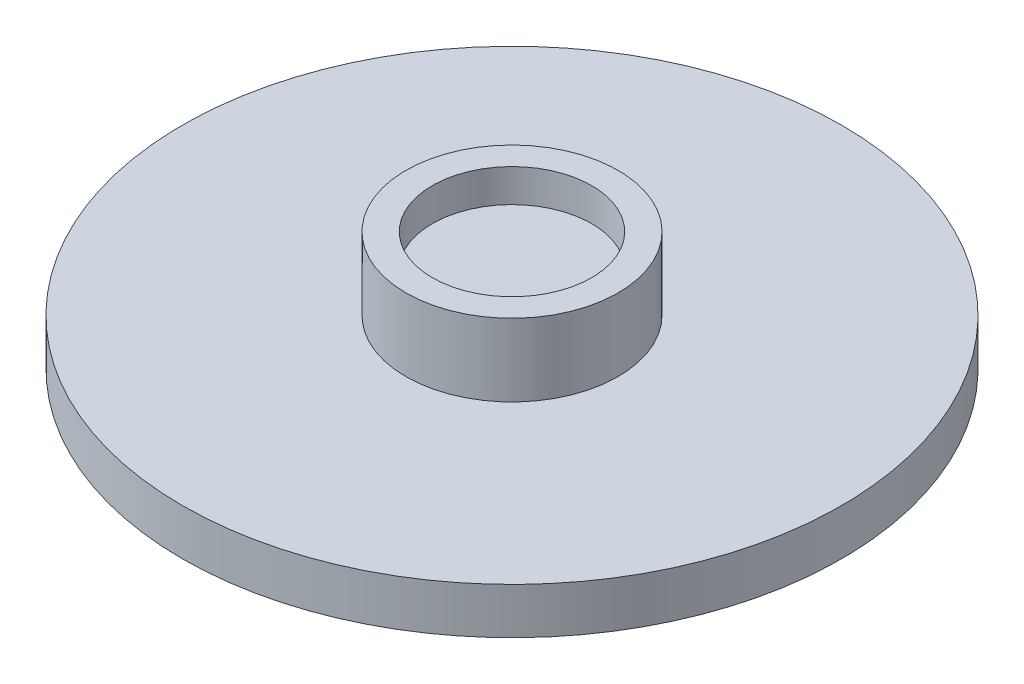
ISO-10303-21;
HEADER;
FILE_DESCRIPTION(('STEP AP214'),'2;1');
FILE_NAME('part.step','',(''),(''),'','','');
FILE_SCHEMA(('AUTOMOTIVE_DESIGN { 1 0 10303 214 1 1 1 1 }'));
ENDSEC;
DATA;
#1=APPLICATION_CONTEXT('core data for automotive mechanical design processes');
#2=APPLICATION_PROTOCOL_DEFINITION('international standard','automotive_design',2000,#1);
#3=PRODUCT_CONTEXT('',#1,'mechanical');
#4=PRODUCT('Part','Part','',(#3));
#5=PRODUCT_RELATED_PRODUCT_CATEGORY('part','',(#4));
#6=PRODUCT_DEFINITION_FORMATION('','',#4);
#7=PRODUCT_DEFINITION_CONTEXT('part definition',#1,'design');
#8=PRODUCT_DEFINITION('design','',#6,#7);
#9=PRODUCT_DEFINITION_SHAPE('','',#8);
#10=(LENGTH_UNIT() NAMED_UNIT(*) SI_UNIT(.MILLI.,.METRE.));
#11=(NAMED_UNIT(*) PLANE_ANGLE_UNIT() SI_UNIT($,.RADIAN.));
#12=(NAMED_UNIT(*) SI_UNIT($,.STERADIAN.) SOLID_ANGLE_UNIT());
#13=UNCERTAINTY_MEASURE_WITH_UNIT(LENGTH_MEASURE(1.E-05),#10,'distance_accuracy_value','');
#14=(GEOMETRIC_REPRESENTATION_CONTEXT(3) GLOBAL_UNCERTAINTY_ASSIGNED_CONTEXT((#13)) GLOBAL_UNIT_ASSIGNED_CONTEXT((#10,
#11,#12)) REPRESENTATION_CONTEXT('',''));
#15=CARTESIAN_POINT('',(0.,0.,0.));
#16=DIRECTION('',(0.,0.,1.));
#17=DIRECTION('',(1.,0.,0.));
#18=AXIS2_PLACEMENT_3D('',#15,#16,#17);
#19=CARTESIAN_POINT('',(0.,3.5,0.));
#20=DIRECTION('',(0.,-1.,0.));
#21=DIRECTION('',(0.,0.,-1.));
#22=AXIS2_PLACEMENT_3D('',#19,#20,#21);
#23=CYLINDRICAL_SURFACE('',#22,25.);
#24=CARTESIAN_POINT('',(0.,3.5,0.));
#25=DIRECTION('',(0.,1.,0.));
#26=DIRECTION('',(0.,0.,1.));
#27=AXIS2_PLACEMENT_3D('',#24,#25,#26);
#28=CIRCLE('',#27,25.);
#29=CARTESIAN_POINT('',(0.,3.5,25.));
#30=VERTEX_POINT('',#29);
#31=EDGE_CURVE('E44',#30,#30,#28,.T.);
#32=ORIENTED_EDGE('',*,*,#31,.F.);
#33=EDGE_LOOP('',(#32));
#34=FACE_BOUND('',#33,.T.);
#35=CARTESIAN_POINT('',(0.,0.,0.));
#36=DIRECTION('',(0.,1.,0.));
#37=DIRECTION('',(0.,0.,1.));
#38=AXIS2_PLACEMENT_3D('',#35,#36,#37);
#39=CIRCLE('',#38,25.);
#40=CARTESIAN_POINT('',(0.,0.,25.));
#41=VERTEX_POINT('',#40);
#42=EDGE_CURVE('E49',#41,#41,#39,.T.);
#43=ORIENTED_EDGE('',*,*,#42,.T.);
#44=EDGE_LOOP('',(#43));
#45=FACE_BOUND('',#44,.T.);
#46=ADVANCED_FACE('F37',(#34,#45),#23,.T.);
#47=CARTESIAN_POINT('',(0.,3.5,0.));
#48=DIRECTION('',(0.,1.,0.));
#49=DIRECTION('',(0.,0.,1.));
#50=AXIS2_PLACEMENT_3D('',#47,#48,#49);
#51=PLANE('',#50);
#52=CARTESIAN_POINT('',(0.,3.5,0.));
#53=DIRECTION('',(0.,1.,0.));
#54=DIRECTION('',(0.,0.,1.));
#55=AXIS2_PLACEMENT_3D('',#52,#53,#54);
#56=CIRCLE('',#55,8.05);
#57=CARTESIAN_POINT('',(0.,3.5,8.05));
#58=VERTEX_POINT('',#57);
#59=EDGE_CURVE('E57',#58,#58,#56,.T.);
#60=ORIENTED_EDGE('',*,*,#59,.F.);
#61=EDGE_LOOP('',(#60));
#62=FACE_BOUND('',#61,.T.);
#63=ORIENTED_EDGE('',*,*,#31,.T.);
#64=EDGE_LOOP('',(#63));
#65=FACE_BOUND('',#64,.T.);
#66=ADVANCED_FACE('F83',(#62,#65),#51,.T.);
#67=CARTESIAN_POINT('',(0.,0.,0.));
#68=DIRECTION('',(0.,1.,0.));
#69=DIRECTION('',(0.,0.,1.));
#70=AXIS2_PLACEMENT_3D('',#67,#68,#69);
#71=PLANE('',#70);
#72=ORIENTED_EDGE('',*,*,#42,.F.);
#73=EDGE_LOOP('',(#72));
#74=FACE_BOUND('',#73,.T.);
#75=ADVANCED_FACE('F74',(#74),#71,.F.);
#76=CARTESIAN_POINT('',(0.,9.,0.));
#77=DIRECTION('',(0.,1.,0.));
#78=DIRECTION('',(0.,0.,1.));
#79=AXIS2_PLACEMENT_3D('',#76,#77,#78);
#80=PLANE('',#79);
#81=CARTESIAN_POINT('',(0.,9.,0.));
#82=DIRECTION('',(0.,1.,0.));
#83=DIRECTION('',(0.,0.,1.));
#84=AXIS2_PLACEMENT_3D('',#81,#82,#83);
#85=CIRCLE('',#84,8.05);
#86=CARTESIAN_POINT('',(0.,9.,8.05));
#87=VERTEX_POINT('',#86);
#88=EDGE_CURVE('E55',#87,#87,#85,.T.);
#89=ORIENTED_EDGE('',*,*,#88,.T.);
#90=EDGE_LOOP('',(#89));
#91=FACE_BOUND('',#90,.T.);
#92=CARTESIAN_POINT('',(0.,9.,0.));
#93=DIRECTION('',(0.,1.,0.));
#94=DIRECTION('',(0.,0.,1.));
#95=AXIS2_PLACEMENT_3D('',#92,#93,#94);
#96=CIRCLE('',#95,6.05);
#97=CARTESIAN_POINT('',(0.,9.,6.05));
#98=VERTEX_POINT('',#97);
#99=EDGE_CURVE('E61',#98,#98,#96,.T.);
#100=ORIENTED_EDGE('',*,*,#99,.F.);
#101=EDGE_LOOP('',(#100));
#102=FACE_BOUND('',#101,.T.);
#103=ADVANCED_FACE('F71',(#91,#102),#80,.T.);
#104=CARTESIAN_POINT('',(0.,9.,0.));
#105=DIRECTION('',(0.,-1.,0.));
#106=DIRECTION('',(0.,0.,-1.));
#107=AXIS2_PLACEMENT_3D('',#104,#105,#106);
#108=CYLINDRICAL_SURFACE('',#107,8.05);
#109=ORIENTED_EDGE('',*,*,#88,.F.);
#110=EDGE_LOOP('',(#109));
#111=FACE_BOUND('',#110,.T.);
#112=ORIENTED_EDGE('',*,*,#59,.T.);
#113=EDGE_LOOP('',(#112));
#114=FACE_BOUND('',#113,.T.);
#115=ADVANCED_FACE('F73',(#111,#114),#108,.T.);
#116=CARTESIAN_POINT('',(0.,9.,0.));
#117=DIRECTION('',(0.,-1.,0.));
#118=DIRECTION('',(0.,0.,-1.));
#119=AXIS2_PLACEMENT_3D('',#116,#117,#118);
#120=CYLINDRICAL_SURFACE('',#119,6.05);
#121=CARTESIAN_POINT('',(0.,6.5,0.));
#122=DIRECTION('',(0.,1.,0.));
#123=DIRECTION('',(0.,0.,1.));
#124=AXIS2_PLACEMENT_3D('',#121,#122,#123);
#125=CIRCLE('',#124,6.05);
#126=CARTESIAN_POINT('',(0.,6.5,6.05));
#127=VERTEX_POINT('',#126);
#128=EDGE_CURVE('E10',#127,#127,#125,.T.);
#129=ORIENTED_EDGE('',*,*,#128,.F.);
#130=EDGE_LOOP('',(#129));
#131=FACE_BOUND('',#130,.T.);
#132=ORIENTED_EDGE('',*,*,#99,.T.);
#133=EDGE_LOOP('',(#132));
#134=FACE_BOUND('',#133,.T.);
#135=ADVANCED_FACE('F69',(#131,#134),#120,.F.);
#136=CARTESIAN_POINT('',(0.,6.5,0.));
#137=DIRECTION('',(0.,1.,0.));
#138=DIRECTION('',(0.,0.,1.));
#139=AXIS2_PLACEMENT_3D('',#136,#137,#138);
#140=PLANE('',#139);
#141=ORIENTED_EDGE('',*,*,#128,.T.);
#142=EDGE_LOOP('',(#141));
#143=FACE_BOUND('',#142,.T.);
#144=ADVANCED_FACE('F128',(#143),#140,.T.);
#145=CLOSED_SHELL('',(#46,#66,#75,#103,#115,#135,#144));
#146=MANIFOLD_SOLID_BREP('B2',#145);
#147=ADVANCED_BREP_SHAPE_REPRESENTATION('',(#18,#146),#14);
#148=SHAPE_DEFINITION_REPRESENTATION(#9,#147);
ENDSEC;
END-ISO-10303-21;
